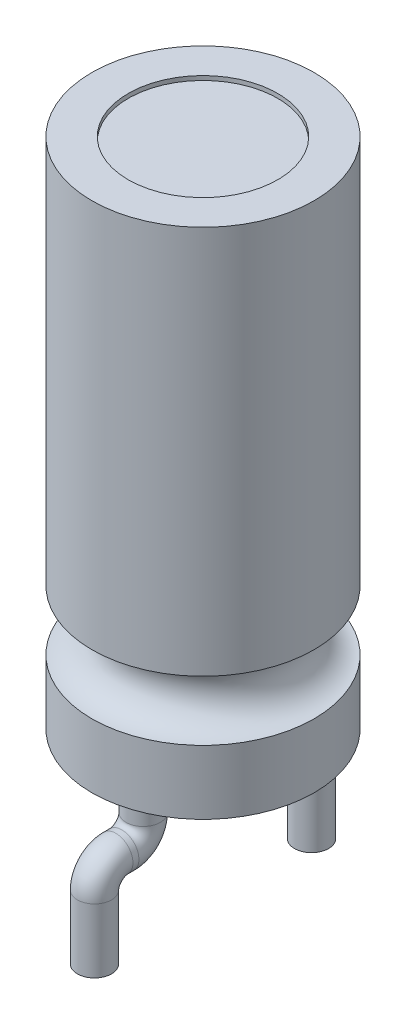
ISO-10303-21;
HEADER;
FILE_DESCRIPTION(('STEP AP214'),'2;1');
FILE_NAME('part.step','',(''),(''),'','','');
FILE_SCHEMA(('AUTOMOTIVE_DESIGN { 1 0 10303 214 1 1 1 1 }'));
ENDSEC;
DATA;
#1=APPLICATION_CONTEXT('core data for automotive mechanical design processes');
#2=APPLICATION_PROTOCOL_DEFINITION('international standard','automotive_design',2000,#1);
#3=PRODUCT_CONTEXT('',#1,'mechanical');
#4=PRODUCT('Part','Part','',(#3));
#5=PRODUCT_RELATED_PRODUCT_CATEGORY('part','',(#4));
#6=PRODUCT_DEFINITION_FORMATION('','',#4);
#7=PRODUCT_DEFINITION_CONTEXT('part definition',#1,'design');
#8=PRODUCT_DEFINITION('design','',#6,#7);
#9=PRODUCT_DEFINITION_SHAPE('','',#8);
#10=(LENGTH_UNIT() NAMED_UNIT(*) SI_UNIT(.MILLI.,.METRE.));
#11=(NAMED_UNIT(*) PLANE_ANGLE_UNIT() SI_UNIT($,.RADIAN.));
#12=(NAMED_UNIT(*) SI_UNIT($,.STERADIAN.) SOLID_ANGLE_UNIT());
#13=UNCERTAINTY_MEASURE_WITH_UNIT(LENGTH_MEASURE(1.E-05),#10,'distance_accuracy_value','');
#14=(GEOMETRIC_REPRESENTATION_CONTEXT(3) GLOBAL_UNCERTAINTY_ASSIGNED_CONTEXT((#13)) GLOBAL_UNIT_ASSIGNED_CONTEXT((#10,
#11,#12)) REPRESENTATION_CONTEXT('',''));
#15=CARTESIAN_POINT('',(0.,0.,0.));
#16=DIRECTION('',(0.,0.,1.));
#17=DIRECTION('',(1.,0.,0.));
#18=AXIS2_PLACEMENT_3D('',#15,#16,#17);
#19=CARTESIAN_POINT('',(2.6,27.5164236634825,0.));
#20=DIRECTION('',(0.,1.,0.));
#21=DIRECTION('',(0.,0.,1.));
#22=AXIS2_PLACEMENT_3D('',#19,#20,#21);
#23=PLANE('',#22);
#24=CARTESIAN_POINT('',(0.,27.5164236634825,1.4));
#25=DIRECTION('',(0.,-1.,0.));
#26=DIRECTION('',(0.,0.,-1.));
#27=AXIS2_PLACEMENT_3D('',#24,#25,#26);
#28=CIRCLE('',#27,0.4);
#29=CARTESIAN_POINT('',(0.,27.5164236634825,1.));
#30=VERTEX_POINT('',#29);
#31=EDGE_CURVE('E43',#30,#30,#28,.T.);
#32=ORIENTED_EDGE('',*,*,#31,.F.);
#33=EDGE_LOOP('',(#32));
#34=FACE_BOUND('',#33,.T.);
#35=CARTESIAN_POINT('',(0.,27.5164236634825,0.));
#36=DIRECTION('',(0.,1.,0.));
#37=DIRECTION('',(0.,0.,1.));
#38=AXIS2_PLACEMENT_3D('',#35,#36,#37);
#39=CIRCLE('',#38,2.6);
#40=CARTESIAN_POINT('',(0.,27.5164236634825,2.6));
#41=VERTEX_POINT('',#40);
#42=EDGE_CURVE('E39',#41,#41,#39,.T.);
#43=ORIENTED_EDGE('',*,*,#42,.F.);
#44=EDGE_LOOP('',(#43));
#45=FACE_BOUND('',#44,.T.);
#46=CARTESIAN_POINT('',(0.,27.5164236634825,-1.4));
#47=DIRECTION('',(0.,-1.,0.));
#48=DIRECTION('',(0.,0.,-1.));
#49=AXIS2_PLACEMENT_3D('',#46,#47,#48);
#50=CIRCLE('',#49,0.4);
#51=CARTESIAN_POINT('',(0.,27.5164236634825,-1.8));
#52=VERTEX_POINT('',#51);
#53=EDGE_CURVE('E10',#52,#52,#50,.T.);
#54=ORIENTED_EDGE('',*,*,#53,.F.);
#55=EDGE_LOOP('',(#54));
#56=FACE_BOUND('',#55,.T.);
#57=ADVANCED_FACE('F36',(#34,#45,#56),#23,.F.);
#58=CARTESIAN_POINT('',(0.,48.4017094017094,0.));
#59=DIRECTION('',(0.,1.,0.));
#60=DIRECTION('',(0.,0.,1.));
#61=AXIS2_PLACEMENT_3D('',#58,#59,#60);
#62=CYLINDRICAL_SURFACE('',#61,2.6);
#63=CARTESIAN_POINT('',(0.,29.0164236634825,0.));
#64=DIRECTION('',(0.,1.,0.));
#65=DIRECTION('',(0.,0.,1.));
#66=AXIS2_PLACEMENT_3D('',#63,#64,#65);
#67=CIRCLE('',#66,2.6);
#68=CARTESIAN_POINT('',(0.,29.0164236634825,2.6));
#69=VERTEX_POINT('',#68);
#70=EDGE_CURVE('E91',#69,#69,#67,.T.);
#71=ORIENTED_EDGE('',*,*,#70,.F.);
#72=EDGE_LOOP('',(#71));
#73=FACE_BOUND('',#72,.T.);
#74=ORIENTED_EDGE('',*,*,#42,.T.);
#75=EDGE_LOOP('',(#74));
#76=FACE_BOUND('',#75,.T.);
#77=ADVANCED_FACE('F98',(#73,#76),#62,.T.);
#78=CARTESIAN_POINT('',(0.,29.7164236634825,0.));
#79=DIRECTION('',(0.,1.,0.));
#80=DIRECTION('',(0.,0.,1.));
#81=AXIS2_PLACEMENT_3D('',#78,#79,#80);
#82=TOROIDAL_SURFACE('',#81,2.6,0.699999999999999);
#83=CARTESIAN_POINT('',(0.,30.4164236634825,0.));
#84=DIRECTION('',(0.,1.,0.));
#85=DIRECTION('',(0.,0.,1.));
#86=AXIS2_PLACEMENT_3D('',#83,#84,#85);
#87=CIRCLE('',#86,2.6);
#88=CARTESIAN_POINT('',(0.,30.4164236634825,2.6));
#89=VERTEX_POINT('',#88);
#90=EDGE_CURVE('E89',#89,#89,#87,.T.);
#91=ORIENTED_EDGE('',*,*,#90,.F.);
#92=EDGE_LOOP('',(#91));
#93=FACE_BOUND('',#92,.T.);
#94=ORIENTED_EDGE('',*,*,#70,.T.);
#95=EDGE_LOOP('',(#94));
#96=FACE_BOUND('',#95,.T.);
#97=ADVANCED_FACE('F106',(#93,#96),#82,.F.);
#98=CARTESIAN_POINT('',(0.,48.4017094017094,0.));
#99=DIRECTION('',(0.,1.,0.));
#100=DIRECTION('',(0.,0.,1.));
#101=AXIS2_PLACEMENT_3D('',#98,#99,#100);
#102=CYLINDRICAL_SURFACE('',#101,2.6);
#103=CARTESIAN_POINT('',(0.,39.5164236634825,0.));
#104=DIRECTION('',(0.,1.,0.));
#105=DIRECTION('',(0.,0.,1.));
#106=AXIS2_PLACEMENT_3D('',#103,#104,#105);
#107=CIRCLE('',#106,2.6);
#108=CARTESIAN_POINT('',(0.,39.5164236634825,2.6));
#109=VERTEX_POINT('',#108);
#110=EDGE_CURVE('E86',#109,#109,#107,.T.);
#111=ORIENTED_EDGE('',*,*,#110,.F.);
#112=EDGE_LOOP('',(#111));
#113=FACE_BOUND('',#112,.T.);
#114=ORIENTED_EDGE('',*,*,#90,.T.);
#115=EDGE_LOOP('',(#114));
#116=FACE_BOUND('',#115,.T.);
#117=ADVANCED_FACE('F151',(#113,#116),#102,.T.);
#118=CARTESIAN_POINT('',(0.,39.5164236634825,0.));
#119=DIRECTION('',(0.,-1.,0.));
#120=DIRECTION('',(0.,0.,-1.));
#121=AXIS2_PLACEMENT_3D('',#118,#119,#120);
#122=PLANE('',#121);
#123=CARTESIAN_POINT('',(0.,39.5164236634825,0.));
#124=DIRECTION('',(0.,1.,0.));
#125=DIRECTION('',(0.,0.,1.));
#126=AXIS2_PLACEMENT_3D('',#123,#124,#125);
#127=CIRCLE('',#126,1.75);
#128=CARTESIAN_POINT('',(0.,39.5164236634825,1.75));
#129=VERTEX_POINT('',#128);
#130=EDGE_CURVE('E80',#129,#129,#127,.T.);
#131=ORIENTED_EDGE('',*,*,#130,.F.);
#132=EDGE_LOOP('',(#131));
#133=FACE_BOUND('',#132,.T.);
#134=ORIENTED_EDGE('',*,*,#110,.T.);
#135=EDGE_LOOP('',(#134));
#136=FACE_BOUND('',#135,.T.);
#137=ADVANCED_FACE('F147',(#133,#136),#122,.F.);
#138=CARTESIAN_POINT('',(0.,39.4164236634825,0.));
#139=DIRECTION('',(0.,1.,0.));
#140=DIRECTION('',(0.,0.,1.));
#141=AXIS2_PLACEMENT_3D('',#138,#139,#140);
#142=CYLINDRICAL_SURFACE('',#141,1.75);
#143=CARTESIAN_POINT('',(0.,39.4164236634825,0.));
#144=DIRECTION('',(0.,1.,0.));
#145=DIRECTION('',(0.,0.,1.));
#146=AXIS2_PLACEMENT_3D('',#143,#144,#145);
#147=CIRCLE('',#146,1.75);
#148=CARTESIAN_POINT('',(0.,39.4164236634825,1.75));
#149=VERTEX_POINT('',#148);
#150=EDGE_CURVE('E83',#149,#149,#147,.T.);
#151=ORIENTED_EDGE('',*,*,#150,.F.);
#152=EDGE_LOOP('',(#151));
#153=FACE_BOUND('',#152,.T.);
#154=ORIENTED_EDGE('',*,*,#130,.T.);
#155=EDGE_LOOP('',(#154));
#156=FACE_BOUND('',#155,.T.);
#157=ADVANCED_FACE('F143',(#153,#156),#142,.F.);
#158=CARTESIAN_POINT('',(0.,39.4164236634825,0.));
#159=DIRECTION('',(0.,1.,0.));
#160=DIRECTION('',(0.,0.,1.));
#161=AXIS2_PLACEMENT_3D('',#158,#159,#160);
#162=PLANE('',#161);
#163=ORIENTED_EDGE('',*,*,#150,.T.);
#164=EDGE_LOOP('',(#163));
#165=FACE_BOUND('',#164,.T.);
#166=ADVANCED_FACE('F139',(#165),#162,.T.);
#167=CARTESIAN_POINT('',(0.,25.5164236634825,2.54));
#168=DIRECTION('',(0.,-1.,0.));
#169=DIRECTION('',(0.,0.,-1.));
#170=AXIS2_PLACEMENT_3D('',#167,#168,#169);
#171=CYLINDRICAL_SURFACE('',#170,0.4);
#172=CARTESIAN_POINT('',(0.,25.5164236634825,2.54));
#173=DIRECTION('',(0.,-1.,0.));
#174=DIRECTION('',(0.,0.,-1.));
#175=AXIS2_PLACEMENT_3D('',#172,#173,#174);
#176=CIRCLE('',#175,0.4);
#177=CARTESIAN_POINT('',(0.,25.5164236634825,2.94));
#178=VERTEX_POINT('',#177);
#179=EDGE_CURVE('E74',#178,#178,#176,.T.);
#180=ORIENTED_EDGE('',*,*,#179,.T.);
#181=EDGE_LOOP('',(#180));
#182=FACE_BOUND('',#181,.T.);
#183=CARTESIAN_POINT('',(0.,24.0164236634825,2.54));
#184=DIRECTION('',(0.,-1.,0.));
#185=DIRECTION('',(0.,0.,-1.));
#186=AXIS2_PLACEMENT_3D('',#183,#184,#185);
#187=CIRCLE('',#186,0.4);
#188=CARTESIAN_POINT('',(0.,24.0164236634825,2.14));
#189=VERTEX_POINT('',#188);
#190=EDGE_CURVE('E77',#189,#189,#187,.T.);
#191=ORIENTED_EDGE('',*,*,#190,.F.);
#192=EDGE_LOOP('',(#191));
#193=FACE_BOUND('',#192,.T.);
#194=ADVANCED_FACE('F135',(#182,#193),#171,.T.);
#195=CARTESIAN_POINT('',(0.,25.5164236634825,2.04));
#196=DIRECTION('',(1.,0.,0.));
#197=DIRECTION('',(0.,0.,-1.));
#198=AXIS2_PLACEMENT_3D('',#195,#196,#197);
#199=TOROIDAL_SURFACE('',#198,0.500000000000004,0.4);
#200=CARTESIAN_POINT('',(0.,26.0164236634825,2.04));
#201=DIRECTION('',(0.,0.,1.));
#202=DIRECTION('',(0.,-1.,0.));
#203=AXIS2_PLACEMENT_3D('',#200,#201,#202);
#204=CIRCLE('',#203,0.4);
#205=CARTESIAN_POINT('',(0.,26.4164236634825,2.03999999999999));
#206=VERTEX_POINT('',#205);
#207=EDGE_CURVE('E71',#206,#206,#204,.T.);
#208=CARTESIAN_POINT('',(0.,25.5164236634825,2.04));
#209=DIRECTION('',(1.,0.,0.));
#210=DIRECTION('',(0.,0.,-1.));
#211=AXIS2_PLACEMENT_3D('',#208,#209,#210);
#212=CIRCLE('',#211,0.900000000000004);
#213=EDGE_CURVE('',#206,#178,#212,.T.);
#214=ORIENTED_EDGE('',*,*,#207,.T.);
#215=ORIENTED_EDGE('',*,*,#179,.F.);
#216=ORIENTED_EDGE('',*,*,#213,.T.);
#217=ORIENTED_EDGE('',*,*,#213,.F.);
#218=EDGE_LOOP('',(#214,#216,#215,#217));
#219=FACE_BOUND('',#218,.T.);
#220=ADVANCED_FACE('F131',(#219),#199,.T.);
#221=CARTESIAN_POINT('',(0.,26.0164236634825,1.90000000000003));
#222=DIRECTION('',(0.,0.,1.));
#223=DIRECTION('',(1.,0.,0.));
#224=AXIS2_PLACEMENT_3D('',#221,#222,#223);
#225=CYLINDRICAL_SURFACE('',#224,0.4);
#226=CARTESIAN_POINT('',(0.,26.0164236634825,1.90000000000003));
#227=DIRECTION('',(0.,0.,1.));
#228=DIRECTION('',(0.,-1.,0.));
#229=AXIS2_PLACEMENT_3D('',#226,#227,#228);
#230=CIRCLE('',#229,0.4);
#231=CARTESIAN_POINT('',(0.,25.6164236634825,1.90000000000005));
#232=VERTEX_POINT('',#231);
#233=EDGE_CURVE('E68',#232,#232,#230,.T.);
#234=ORIENTED_EDGE('',*,*,#233,.T.);
#235=EDGE_LOOP('',(#234));
#236=FACE_BOUND('',#235,.T.);
#237=ORIENTED_EDGE('',*,*,#207,.F.);
#238=EDGE_LOOP('',(#237));
#239=FACE_BOUND('',#238,.T.);
#240=ADVANCED_FACE('F123',(#236,#239),#225,.T.);
#241=CARTESIAN_POINT('',(0.,26.5164236634825,1.9));
#242=DIRECTION('',(-1.,0.,0.));
#243=DIRECTION('',(0.,0.,1.));
#244=AXIS2_PLACEMENT_3D('',#241,#242,#243);
#245=TOROIDAL_SURFACE('',#244,0.5,0.4);
#246=CARTESIAN_POINT('',(0.,26.5164236634825,1.4));
#247=DIRECTION('',(0.,-1.,0.));
#248=DIRECTION('',(0.,0.,-1.));
#249=AXIS2_PLACEMENT_3D('',#246,#247,#248);
#250=CIRCLE('',#249,0.4);
#251=CARTESIAN_POINT('',(0.,26.5164236634825,1.));
#252=VERTEX_POINT('',#251);
#253=EDGE_CURVE('E64',#252,#252,#250,.T.);
#254=CARTESIAN_POINT('',(0.,26.5164236634825,1.9));
#255=DIRECTION('',(-1.,0.,0.));
#256=DIRECTION('',(0.,0.,1.));
#257=AXIS2_PLACEMENT_3D('',#254,#255,#256);
#258=CIRCLE('',#257,0.9);
#259=EDGE_CURVE('',#252,#232,#258,.T.);
#260=ORIENTED_EDGE('',*,*,#253,.T.);
#261=ORIENTED_EDGE('',*,*,#233,.F.);
#262=ORIENTED_EDGE('',*,*,#259,.T.);
#263=ORIENTED_EDGE('',*,*,#259,.F.);
#264=EDGE_LOOP('',(#260,#262,#261,#263));
#265=FACE_BOUND('',#264,.T.);
#266=ADVANCED_FACE('F113',(#265),#245,.T.);
#267=CARTESIAN_POINT('',(0.,26.5164236634825,1.4));
#268=DIRECTION('',(0.,1.,0.));
#269=DIRECTION('',(0.,0.,1.));
#270=AXIS2_PLACEMENT_3D('',#267,#268,#269);
#271=CYLINDRICAL_SURFACE('',#270,0.4);
#272=ORIENTED_EDGE('',*,*,#253,.F.);
#273=EDGE_LOOP('',(#272));
#274=FACE_BOUND('',#273,.T.);
#275=ORIENTED_EDGE('',*,*,#31,.T.);
#276=EDGE_LOOP('',(#275));
#277=FACE_BOUND('',#276,.T.);
#278=ADVANCED_FACE('F110',(#274,#277),#271,.T.);
#279=CARTESIAN_POINT('',(0.,24.0164236634825,2.54));
#280=DIRECTION('',(0.,-1.,0.));
#281=DIRECTION('',(0.,0.,-1.));
#282=AXIS2_PLACEMENT_3D('',#279,#280,#281);
#283=PLANE('',#282);
#284=ORIENTED_EDGE('',*,*,#190,.T.);
#285=EDGE_LOOP('',(#284));
#286=FACE_BOUND('',#285,.T.);
#287=ADVANCED_FACE('F112',(#286),#283,.T.);
#288=CARTESIAN_POINT('',(0.,25.5164236634825,-2.54));
#289=DIRECTION('',(0.,-1.,0.));
#290=DIRECTION('',(0.,0.,-1.));
#291=AXIS2_PLACEMENT_3D('',#288,#289,#290);
#292=CYLINDRICAL_SURFACE('',#291,0.4);
#293=CARTESIAN_POINT('',(0.,25.5164236634825,-2.54));
#294=DIRECTION('',(0.,-1.,0.));
#295=DIRECTION('',(0.,0.,-1.));
#296=AXIS2_PLACEMENT_3D('',#293,#294,#295);
#297=CIRCLE('',#296,0.4);
#298=CARTESIAN_POINT('',(0.,25.5164236634825,-2.94));
#299=VERTEX_POINT('',#298);
#300=EDGE_CURVE('E59',#299,#299,#297,.T.);
#301=ORIENTED_EDGE('',*,*,#300,.T.);
#302=EDGE_LOOP('',(#301));
#303=FACE_BOUND('',#302,.T.);
#304=CARTESIAN_POINT('',(0.,24.0164236634825,-2.54));
#305=DIRECTION('',(0.,-1.,0.));
#306=DIRECTION('',(0.,0.,-1.));
#307=AXIS2_PLACEMENT_3D('',#304,#305,#306);
#308=CIRCLE('',#307,0.4);
#309=CARTESIAN_POINT('',(0.,24.0164236634825,-2.94));
#310=VERTEX_POINT('',#309);
#311=EDGE_CURVE('E62',#310,#310,#308,.T.);
#312=ORIENTED_EDGE('',*,*,#311,.F.);
#313=EDGE_LOOP('',(#312));
#314=FACE_BOUND('',#313,.T.);
#315=ADVANCED_FACE('F120',(#303,#314),#292,.T.);
#316=CARTESIAN_POINT('',(0.,25.5164236634825,-2.04));
#317=DIRECTION('',(-1.,0.,0.));
#318=DIRECTION('',(0.,0.,1.));
#319=AXIS2_PLACEMENT_3D('',#316,#317,#318);
#320=TOROIDAL_SURFACE('',#319,0.500000000000004,0.4);
#321=CARTESIAN_POINT('',(0.,26.0164236634825,-2.03999999999999));
#322=DIRECTION('',(0.,0.,-1.));
#323=DIRECTION('',(0.,1.,0.));
#324=AXIS2_PLACEMENT_3D('',#321,#322,#323);
#325=CIRCLE('',#324,0.4);
#326=CARTESIAN_POINT('',(0.,26.4164236634825,-2.03999999999999));
#327=VERTEX_POINT('',#326);
#328=EDGE_CURVE('E56',#327,#327,#325,.T.);
#329=CARTESIAN_POINT('',(0.,25.5164236634825,-2.04));
#330=DIRECTION('',(-1.,0.,0.));
#331=DIRECTION('',(0.,0.,1.));
#332=AXIS2_PLACEMENT_3D('',#329,#330,#331);
#333=CIRCLE('',#332,0.900000000000004);
#334=EDGE_CURVE('',#327,#299,#333,.T.);
#335=ORIENTED_EDGE('',*,*,#328,.T.);
#336=ORIENTED_EDGE('',*,*,#300,.F.);
#337=ORIENTED_EDGE('',*,*,#334,.T.);
#338=ORIENTED_EDGE('',*,*,#334,.F.);
#339=EDGE_LOOP('',(#335,#337,#336,#338));
#340=FACE_BOUND('',#339,.T.);
#341=ADVANCED_FACE('F216',(#340),#320,.T.);
#342=CARTESIAN_POINT('',(0.,26.0164236634825,-1.9));
#343=DIRECTION('',(0.,0.,-1.));
#344=DIRECTION('',(-1.,0.,0.));
#345=AXIS2_PLACEMENT_3D('',#342,#343,#344);
#346=CYLINDRICAL_SURFACE('',#345,0.4);
#347=CARTESIAN_POINT('',(0.,26.0164236634825,-1.9));
#348=DIRECTION('',(0.,0.,-1.));
#349=DIRECTION('',(0.,1.,0.));
#350=AXIS2_PLACEMENT_3D('',#347,#348,#349);
#351=CIRCLE('',#350,0.4);
#352=CARTESIAN_POINT('',(0.,25.6164236634825,-1.9));
#353=VERTEX_POINT('',#352);
#354=EDGE_CURVE('E53',#353,#353,#351,.T.);
#355=ORIENTED_EDGE('',*,*,#354,.T.);
#356=EDGE_LOOP('',(#355));
#357=FACE_BOUND('',#356,.T.);
#358=ORIENTED_EDGE('',*,*,#328,.F.);
#359=EDGE_LOOP('',(#358));
#360=FACE_BOUND('',#359,.T.);
#361=ADVANCED_FACE('F225',(#357,#360),#346,.T.);
#362=CARTESIAN_POINT('',(0.,26.5164236634825,-1.9));
#363=DIRECTION('',(1.,0.,0.));
#364=DIRECTION('',(0.,0.,-1.));
#365=AXIS2_PLACEMENT_3D('',#362,#363,#364);
#366=TOROIDAL_SURFACE('',#365,0.5,0.4);
#367=CARTESIAN_POINT('',(0.,26.5164236634825,-1.4));
#368=DIRECTION('',(0.,-1.,0.));
#369=DIRECTION('',(0.,0.,-1.));
#370=AXIS2_PLACEMENT_3D('',#367,#368,#369);
#371=CIRCLE('',#370,0.4);
#372=CARTESIAN_POINT('',(0.,26.5164236634825,-0.999999999999999));
#373=VERTEX_POINT('',#372);
#374=EDGE_CURVE('E50',#373,#373,#371,.T.);
#375=CARTESIAN_POINT('',(0.,26.5164236634825,-1.9));
#376=DIRECTION('',(1.,0.,0.));
#377=DIRECTION('',(0.,0.,-1.));
#378=AXIS2_PLACEMENT_3D('',#375,#376,#377);
#379=CIRCLE('',#378,0.9);
#380=EDGE_CURVE('',#373,#353,#379,.T.);
#381=ORIENTED_EDGE('',*,*,#374,.T.);
#382=ORIENTED_EDGE('',*,*,#354,.F.);
#383=ORIENTED_EDGE('',*,*,#380,.T.);
#384=ORIENTED_EDGE('',*,*,#380,.F.);
#385=EDGE_LOOP('',(#381,#383,#382,#384));
#386=FACE_BOUND('',#385,.T.);
#387=ADVANCED_FACE('F235',(#386),#366,.T.);
#388=CARTESIAN_POINT('',(0.,26.5164236634825,-1.4));
#389=DIRECTION('',(0.,1.,0.));
#390=DIRECTION('',(0.,0.,1.));
#391=AXIS2_PLACEMENT_3D('',#388,#389,#390);
#392=CYLINDRICAL_SURFACE('',#391,0.4);
#393=ORIENTED_EDGE('',*,*,#374,.F.);
#394=EDGE_LOOP('',(#393));
#395=FACE_BOUND('',#394,.T.);
#396=ORIENTED_EDGE('',*,*,#53,.T.);
#397=EDGE_LOOP('',(#396));
#398=FACE_BOUND('',#397,.T.);
#399=ADVANCED_FACE('F245',(#395,#398),#392,.T.);
#400=CARTESIAN_POINT('',(0.,24.0164236634825,-2.54));
#401=DIRECTION('',(0.,-1.,0.));
#402=DIRECTION('',(0.,0.,-1.));
#403=AXIS2_PLACEMENT_3D('',#400,#401,#402);
#404=PLANE('',#403);
#405=ORIENTED_EDGE('',*,*,#311,.T.);
#406=EDGE_LOOP('',(#405));
#407=FACE_BOUND('',#406,.T.);
#408=ADVANCED_FACE('F255',(#407),#404,.T.);
#409=CLOSED_SHELL('',(#57,#77,#97,#117,#137,#157,#166,#194,#220,#240,#266,#278,#287,#315,#341,
#361,#387,#399,#408));
#410=MANIFOLD_SOLID_BREP('B2',#409);
#411=ADVANCED_BREP_SHAPE_REPRESENTATION('',(#18,#410),#14);
#412=SHAPE_DEFINITION_REPRESENTATION(#9,#411);
ENDSEC;
END-ISO-10303-21;
